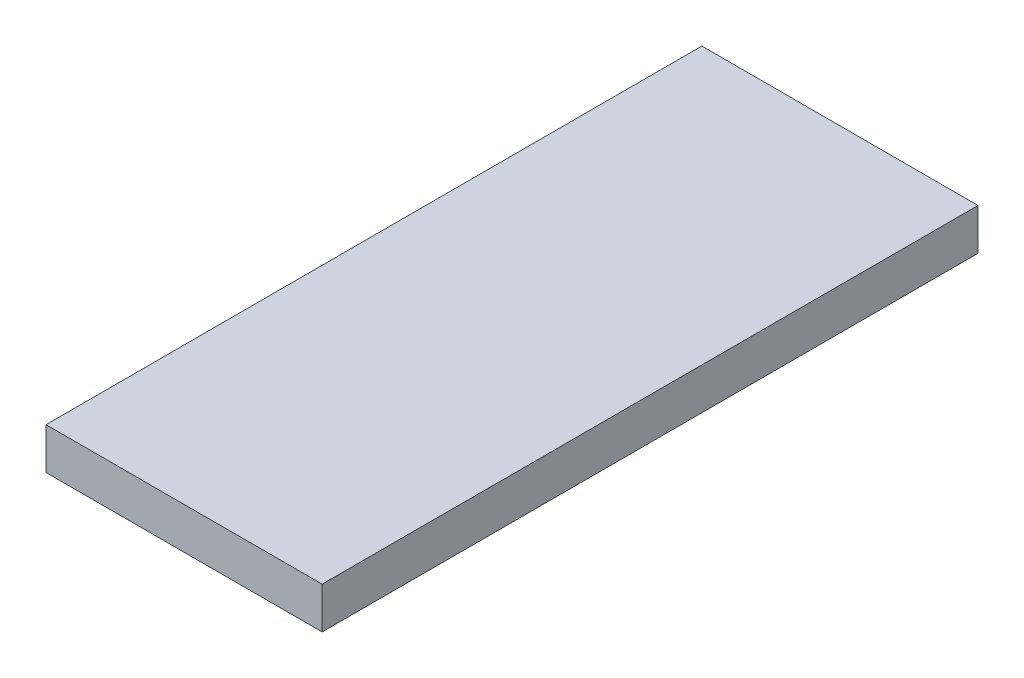
ISO-10303-21;
HEADER;
FILE_DESCRIPTION(('STEP AP214'),'2;1');
FILE_NAME('part.step','',(''),(''),'','','');
FILE_SCHEMA(('AUTOMOTIVE_DESIGN { 1 0 10303 214 1 1 1 1 }'));
ENDSEC;
DATA;
#1=APPLICATION_CONTEXT('core data for automotive mechanical design processes');
#2=APPLICATION_PROTOCOL_DEFINITION('international standard','automotive_design',2000,#1);
#3=PRODUCT_CONTEXT('',#1,'mechanical');
#4=PRODUCT('Part','Part','',(#3));
#5=PRODUCT_RELATED_PRODUCT_CATEGORY('part','',(#4));
#6=PRODUCT_DEFINITION_FORMATION('','',#4);
#7=PRODUCT_DEFINITION_CONTEXT('part definition',#1,'design');
#8=PRODUCT_DEFINITION('design','',#6,#7);
#9=PRODUCT_DEFINITION_SHAPE('','',#8);
#10=(LENGTH_UNIT() NAMED_UNIT(*) SI_UNIT(.MILLI.,.METRE.));
#11=(NAMED_UNIT(*) PLANE_ANGLE_UNIT() SI_UNIT($,.RADIAN.));
#12=(NAMED_UNIT(*) SI_UNIT($,.STERADIAN.) SOLID_ANGLE_UNIT());
#13=UNCERTAINTY_MEASURE_WITH_UNIT(LENGTH_MEASURE(1.E-05),#10,'distance_accuracy_value','');
#14=(GEOMETRIC_REPRESENTATION_CONTEXT(3) GLOBAL_UNCERTAINTY_ASSIGNED_CONTEXT((#13)) GLOBAL_UNIT_ASSIGNED_CONTEXT((#10,
#11,#12)) REPRESENTATION_CONTEXT('',''));
#15=CARTESIAN_POINT('',(0.,0.,0.));
#16=DIRECTION('',(0.,0.,1.));
#17=DIRECTION('',(1.,0.,0.));
#18=AXIS2_PLACEMENT_3D('',#15,#16,#17);
#19=CARTESIAN_POINT('',(0.,2.4,0.));
#20=DIRECTION('',(1.,0.,0.));
#21=DIRECTION('',(0.,0.,-1.));
#22=AXIS2_PLACEMENT_3D('',#19,#20,#21);
#23=PLANE('',#22);
#24=DIRECTION('',(0.,0.,1.));
#25=VECTOR('',#24,1.);
#26=CARTESIAN_POINT('',(0.,0.,0.));
#27=LINE('',#26,#25);
#28=CARTESIAN_POINT('',(0.,0.,-38.));
#29=VERTEX_POINT('',#28);
#30=CARTESIAN_POINT('',(0.,0.,0.));
#31=VERTEX_POINT('',#30);
#32=EDGE_CURVE('E96',#29,#31,#27,.T.);
#33=ORIENTED_EDGE('',*,*,#32,.T.);
#34=DIRECTION('',(0.,-1.,0.));
#35=VECTOR('',#34,1.);
#36=CARTESIAN_POINT('',(0.,2.4,0.));
#37=LINE('',#36,#35);
#38=CARTESIAN_POINT('',(0.,2.4,0.));
#39=VERTEX_POINT('',#38);
#40=EDGE_CURVE('E11',#39,#31,#37,.T.);
#41=ORIENTED_EDGE('',*,*,#40,.F.);
#42=DIRECTION('',(0.,0.,1.));
#43=VECTOR('',#42,1.);
#44=CARTESIAN_POINT('',(0.,2.4,0.));
#45=LINE('',#44,#43);
#46=CARTESIAN_POINT('',(0.,2.4,-38.));
#47=VERTEX_POINT('',#46);
#48=EDGE_CURVE('E84',#47,#39,#45,.T.);
#49=ORIENTED_EDGE('',*,*,#48,.F.);
#50=DIRECTION('',(0.,-1.,0.));
#51=VECTOR('',#50,1.);
#52=CARTESIAN_POINT('',(0.,2.4,-38.));
#53=LINE('',#52,#51);
#54=EDGE_CURVE('E92',#47,#29,#53,.T.);
#55=ORIENTED_EDGE('',*,*,#54,.T.);
#56=EDGE_LOOP('',(#33,#41,#49,#55));
#57=FACE_BOUND('',#56,.T.);
#58=ADVANCED_FACE('F33',(#57),#23,.F.);
#59=CARTESIAN_POINT('',(0.,2.4,0.));
#60=DIRECTION('',(0.,0.,-1.));
#61=DIRECTION('',(-1.,0.,0.));
#62=AXIS2_PLACEMENT_3D('',#59,#60,#61);
#63=PLANE('',#62);
#64=DIRECTION('',(1.,0.,0.));
#65=VECTOR('',#64,1.);
#66=CARTESIAN_POINT('',(0.,0.,0.));
#67=LINE('',#66,#65);
#68=CARTESIAN_POINT('',(16.,0.,0.));
#69=VERTEX_POINT('',#68);
#70=EDGE_CURVE('E88',#31,#69,#67,.T.);
#71=ORIENTED_EDGE('',*,*,#70,.T.);
#72=DIRECTION('',(0.,-1.,0.));
#73=VECTOR('',#72,1.);
#74=CARTESIAN_POINT('',(16.,2.4,0.));
#75=LINE('',#74,#73);
#76=CARTESIAN_POINT('',(16.,2.4,0.));
#77=VERTEX_POINT('',#76);
#78=EDGE_CURVE('E41',#77,#69,#75,.T.);
#79=ORIENTED_EDGE('',*,*,#78,.F.);
#80=DIRECTION('',(1.,0.,0.));
#81=VECTOR('',#80,1.);
#82=CARTESIAN_POINT('',(0.,2.4,0.));
#83=LINE('',#82,#81);
#84=EDGE_CURVE('E79',#39,#77,#83,.T.);
#85=ORIENTED_EDGE('',*,*,#84,.F.);
#86=ORIENTED_EDGE('',*,*,#40,.T.);
#87=EDGE_LOOP('',(#71,#79,#85,#86));
#88=FACE_BOUND('',#87,.T.);
#89=ADVANCED_FACE('F87',(#88),#63,.F.);
#90=CARTESIAN_POINT('',(16.,2.4,0.));
#91=DIRECTION('',(-1.,0.,0.));
#92=DIRECTION('',(0.,0.,1.));
#93=AXIS2_PLACEMENT_3D('',#90,#91,#92);
#94=PLANE('',#93);
#95=DIRECTION('',(0.,0.,-1.));
#96=VECTOR('',#95,1.);
#97=CARTESIAN_POINT('',(16.,0.,0.));
#98=LINE('',#97,#96);
#99=CARTESIAN_POINT('',(16.,0.,-38.));
#100=VERTEX_POINT('',#99);
#101=EDGE_CURVE('E66',#69,#100,#98,.T.);
#102=ORIENTED_EDGE('',*,*,#101,.T.);
#103=DIRECTION('',(0.,-1.,0.));
#104=VECTOR('',#103,1.);
#105=CARTESIAN_POINT('',(16.,2.4,-38.));
#106=LINE('',#105,#104);
#107=CARTESIAN_POINT('',(16.,2.4,-38.));
#108=VERTEX_POINT('',#107);
#109=EDGE_CURVE('E89',#108,#100,#106,.T.);
#110=ORIENTED_EDGE('',*,*,#109,.F.);
#111=DIRECTION('',(0.,0.,-1.));
#112=VECTOR('',#111,1.);
#113=CARTESIAN_POINT('',(16.,2.4,0.));
#114=LINE('',#113,#112);
#115=EDGE_CURVE('E82',#77,#108,#114,.T.);
#116=ORIENTED_EDGE('',*,*,#115,.F.);
#117=ORIENTED_EDGE('',*,*,#78,.T.);
#118=EDGE_LOOP('',(#102,#110,#116,#117));
#119=FACE_BOUND('',#118,.T.);
#120=ADVANCED_FACE('F90',(#119),#94,.F.);
#121=CARTESIAN_POINT('',(0.,2.4,-38.));
#122=DIRECTION('',(0.,0.,1.));
#123=DIRECTION('',(1.,0.,0.));
#124=AXIS2_PLACEMENT_3D('',#121,#122,#123);
#125=PLANE('',#124);
#126=DIRECTION('',(-1.,0.,0.));
#127=VECTOR('',#126,1.);
#128=CARTESIAN_POINT('',(0.,0.,-38.));
#129=LINE('',#128,#127);
#130=EDGE_CURVE('E72',#100,#29,#129,.T.);
#131=ORIENTED_EDGE('',*,*,#130,.T.);
#132=ORIENTED_EDGE('',*,*,#54,.F.);
#133=DIRECTION('',(-1.,0.,0.));
#134=VECTOR('',#133,1.);
#135=CARTESIAN_POINT('',(0.,2.4,-38.));
#136=LINE('',#135,#134);
#137=EDGE_CURVE('E49',#108,#47,#136,.T.);
#138=ORIENTED_EDGE('',*,*,#137,.F.);
#139=ORIENTED_EDGE('',*,*,#109,.T.);
#140=EDGE_LOOP('',(#131,#132,#138,#139));
#141=FACE_BOUND('',#140,.T.);
#142=ADVANCED_FACE('F103',(#141),#125,.F.);
#143=CARTESIAN_POINT('',(0.,2.4,0.));
#144=DIRECTION('',(0.,-1.,0.));
#145=DIRECTION('',(0.,0.,-1.));
#146=AXIS2_PLACEMENT_3D('',#143,#144,#145);
#147=PLANE('',#146);
#148=ORIENTED_EDGE('',*,*,#48,.T.);
#149=ORIENTED_EDGE('',*,*,#84,.T.);
#150=ORIENTED_EDGE('',*,*,#115,.T.);
#151=ORIENTED_EDGE('',*,*,#137,.T.);
#152=EDGE_LOOP('',(#148,#149,#150,#151));
#153=FACE_BOUND('',#152,.T.);
#154=ADVANCED_FACE('F80',(#153),#147,.F.);
#155=CARTESIAN_POINT('',(0.,0.,0.));
#156=DIRECTION('',(0.,-1.,0.));
#157=DIRECTION('',(0.,0.,-1.));
#158=AXIS2_PLACEMENT_3D('',#155,#156,#157);
#159=PLANE('',#158);
#160=ORIENTED_EDGE('',*,*,#32,.F.);
#161=ORIENTED_EDGE('',*,*,#130,.F.);
#162=ORIENTED_EDGE('',*,*,#101,.F.);
#163=ORIENTED_EDGE('',*,*,#70,.F.);
#164=EDGE_LOOP('',(#160,#161,#162,#163));
#165=FACE_BOUND('',#164,.T.);
#166=ADVANCED_FACE('F106',(#165),#159,.T.);
#167=CLOSED_SHELL('',(#58,#89,#120,#142,#154,#166));
#168=MANIFOLD_SOLID_BREP('B2',#167);
#169=ADVANCED_BREP_SHAPE_REPRESENTATION('',(#18,#168),#14);
#170=SHAPE_DEFINITION_REPRESENTATION(#9,#169);
ENDSEC;
END-ISO-10303-21;
